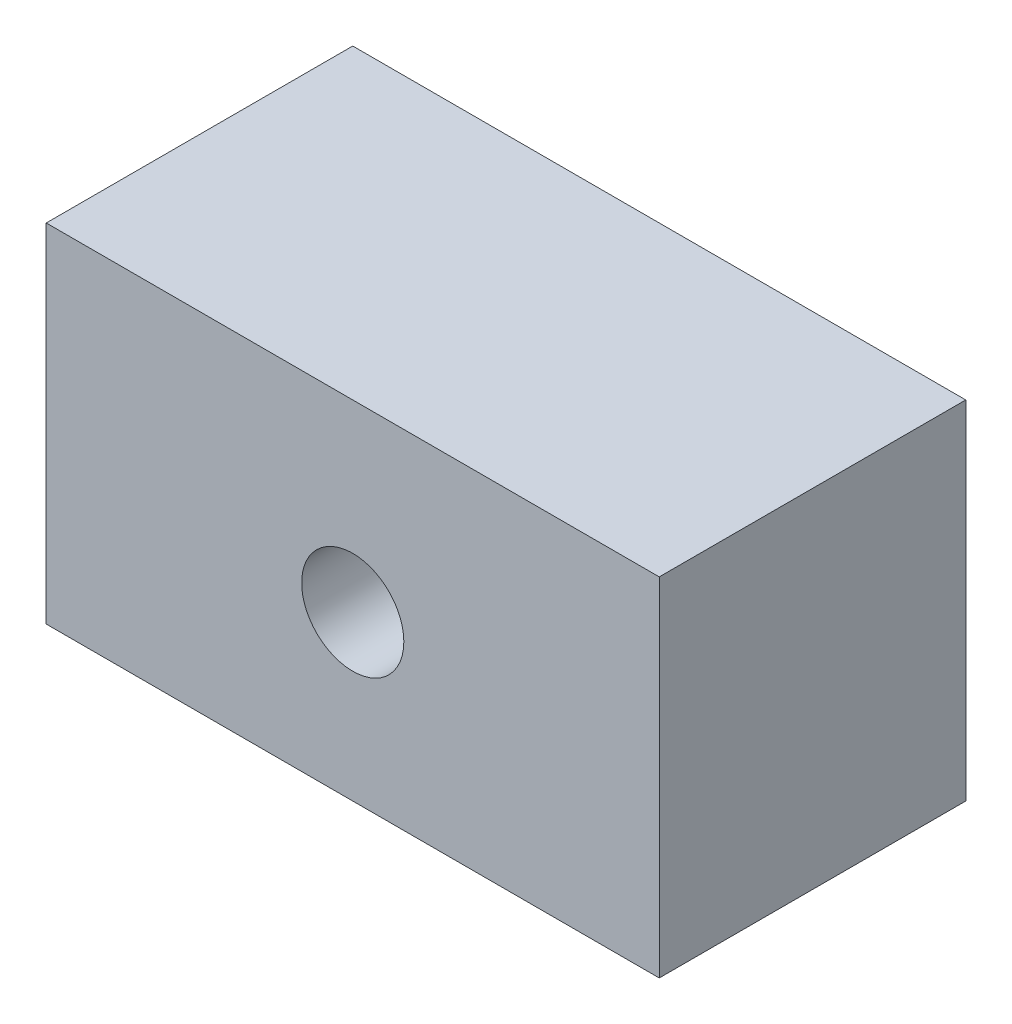
ISO-10303-21;
HEADER;
FILE_DESCRIPTION(('STEP AP214'),'2;1');
FILE_NAME('part.step','',(''),(''),'','','');
FILE_SCHEMA(('AUTOMOTIVE_DESIGN { 1 0 10303 214 1 1 1 1 }'));
ENDSEC;
DATA;
#1=APPLICATION_CONTEXT('core data for automotive mechanical design processes');
#2=APPLICATION_PROTOCOL_DEFINITION('international standard','automotive_design',2000,#1);
#3=PRODUCT_CONTEXT('',#1,'mechanical');
#4=PRODUCT('Part','Part','',(#3));
#5=PRODUCT_RELATED_PRODUCT_CATEGORY('part','',(#4));
#6=PRODUCT_DEFINITION_FORMATION('','',#4);
#7=PRODUCT_DEFINITION_CONTEXT('part definition',#1,'design');
#8=PRODUCT_DEFINITION('design','',#6,#7);
#9=PRODUCT_DEFINITION_SHAPE('','',#8);
#10=(LENGTH_UNIT() NAMED_UNIT(*) SI_UNIT(.MILLI.,.METRE.));
#11=(NAMED_UNIT(*) PLANE_ANGLE_UNIT() SI_UNIT($,.RADIAN.));
#12=(NAMED_UNIT(*) SI_UNIT($,.STERADIAN.) SOLID_ANGLE_UNIT());
#13=UNCERTAINTY_MEASURE_WITH_UNIT(LENGTH_MEASURE(1.E-05),#10,'distance_accuracy_value','');
#14=(GEOMETRIC_REPRESENTATION_CONTEXT(3) GLOBAL_UNCERTAINTY_ASSIGNED_CONTEXT((#13)) GLOBAL_UNIT_ASSIGNED_CONTEXT((#10,
#11,#12)) REPRESENTATION_CONTEXT('',''));
#15=CARTESIAN_POINT('',(0.,0.,0.));
#16=DIRECTION('',(0.,0.,1.));
#17=DIRECTION('',(1.,0.,0.));
#18=AXIS2_PLACEMENT_3D('',#15,#16,#17);
#19=CARTESIAN_POINT('',(0.,0.,0.003500000000031));
#20=DIRECTION('',(0.,0.,1.));
#21=DIRECTION('',(1.,0.,0.));
#22=AXIS2_PLACEMENT_3D('',#19,#20,#21);
#23=PLANE('',#22);
#24=CARTESIAN_POINT('',(30.,16.,0.003500000000031));
#25=DIRECTION('',(0.,0.,1.));
#26=DIRECTION('',(1.,0.,0.));
#27=AXIS2_PLACEMENT_3D('',#24,#25,#26);
#28=CIRCLE('',#27,5.);
#29=CARTESIAN_POINT('',(35.,16.,0.003500000000031));
#30=VERTEX_POINT('',#29);
#31=EDGE_CURVE('E18',#30,#30,#28,.T.);
#32=ORIENTED_EDGE('',*,*,#31,.T.);
#33=EDGE_LOOP('',(#32));
#34=FACE_BOUND('',#33,.T.);
#35=DIRECTION('',(0.,1.,0.));
#36=VECTOR('',#35,1.);
#37=CARTESIAN_POINT('',(60.,0.,0.003500000000031));
#38=LINE('',#37,#36);
#39=CARTESIAN_POINT('',(60.,0.,0.003500000000031));
#40=VERTEX_POINT('',#39);
#41=CARTESIAN_POINT('',(60.,34.,0.003500000000031));
#42=VERTEX_POINT('',#41);
#43=EDGE_CURVE('E59',#40,#42,#38,.T.);
#44=ORIENTED_EDGE('',*,*,#43,.F.);
#45=DIRECTION('',(1.,0.,0.));
#46=VECTOR('',#45,1.);
#47=CARTESIAN_POINT('',(0.,0.,0.003500000000031));
#48=LINE('',#47,#46);
#49=CARTESIAN_POINT('',(0.,0.,0.003500000000031));
#50=VERTEX_POINT('',#49);
#51=EDGE_CURVE('E53',#40,#50,#48,.F.);
#52=ORIENTED_EDGE('',*,*,#51,.T.);
#53=DIRECTION('',(0.,1.,0.));
#54=VECTOR('',#53,1.);
#55=CARTESIAN_POINT('',(0.,0.,0.003500000000031));
#56=LINE('',#55,#54);
#57=CARTESIAN_POINT('',(0.,34.,0.003500000000031));
#58=VERTEX_POINT('',#57);
#59=EDGE_CURVE('E57',#50,#58,#56,.T.);
#60=ORIENTED_EDGE('',*,*,#59,.T.);
#61=DIRECTION('',(1.,0.,0.));
#62=VECTOR('',#61,1.);
#63=CARTESIAN_POINT('',(0.,34.,0.003500000000031));
#64=LINE('',#63,#62);
#65=EDGE_CURVE('E79',#42,#58,#64,.F.);
#66=ORIENTED_EDGE('',*,*,#65,.F.);
#67=EDGE_LOOP('',(#44,#52,#60,#66));
#68=FACE_BOUND('',#67,.T.);
#69=ADVANCED_FACE('F15',(#34,#68),#23,.F.);
#70=CARTESIAN_POINT('',(0.,0.,0.003500000000031));
#71=DIRECTION('',(1.,0.,0.));
#72=DIRECTION('',(0.,0.,-1.));
#73=AXIS2_PLACEMENT_3D('',#70,#71,#72);
#74=PLANE('',#73);
#75=DIRECTION('',(0.,0.,1.));
#76=VECTOR('',#75,1.);
#77=CARTESIAN_POINT('',(0.,34.,0.003500000000031));
#78=LINE('',#77,#76);
#79=CARTESIAN_POINT('',(0.,34.,30.0035));
#80=VERTEX_POINT('',#79);
#81=EDGE_CURVE('E67',#58,#80,#78,.T.);
#82=ORIENTED_EDGE('',*,*,#81,.F.);
#83=ORIENTED_EDGE('',*,*,#59,.F.);
#84=DIRECTION('',(0.,0.,1.));
#85=VECTOR('',#84,1.);
#86=CARTESIAN_POINT('',(0.,0.,0.003500000000031));
#87=LINE('',#86,#85);
#88=CARTESIAN_POINT('',(0.,0.,30.0035));
#89=VERTEX_POINT('',#88);
#90=EDGE_CURVE('E61',#50,#89,#87,.T.);
#91=ORIENTED_EDGE('',*,*,#90,.T.);
#92=DIRECTION('',(0.,1.,0.));
#93=VECTOR('',#92,1.);
#94=CARTESIAN_POINT('',(0.,0.,30.0035));
#95=LINE('',#94,#93);
#96=EDGE_CURVE('E83',#80,#89,#95,.F.);
#97=ORIENTED_EDGE('',*,*,#96,.F.);
#98=EDGE_LOOP('',(#82,#83,#91,#97));
#99=FACE_BOUND('',#98,.T.);
#100=ADVANCED_FACE('F64',(#99),#74,.F.);
#101=CARTESIAN_POINT('',(0.,0.,0.003500000000031));
#102=DIRECTION('',(0.,1.,0.));
#103=DIRECTION('',(0.,0.,1.));
#104=AXIS2_PLACEMENT_3D('',#101,#102,#103);
#105=PLANE('',#104);
#106=DIRECTION('',(1.,0.,0.));
#107=VECTOR('',#106,1.);
#108=CARTESIAN_POINT('',(0.,0.,30.0035));
#109=LINE('',#108,#107);
#110=CARTESIAN_POINT('',(60.,0.,30.0035));
#111=VERTEX_POINT('',#110);
#112=EDGE_CURVE('E72',#89,#111,#109,.T.);
#113=ORIENTED_EDGE('',*,*,#112,.F.);
#114=ORIENTED_EDGE('',*,*,#90,.F.);
#115=ORIENTED_EDGE('',*,*,#51,.F.);
#116=DIRECTION('',(0.,0.,-1.));
#117=VECTOR('',#116,1.);
#118=CARTESIAN_POINT('',(60.,0.,0.003500000000031));
#119=LINE('',#118,#117);
#120=EDGE_CURVE('E74',#111,#40,#119,.T.);
#121=ORIENTED_EDGE('',*,*,#120,.F.);
#122=EDGE_LOOP('',(#113,#114,#115,#121));
#123=FACE_BOUND('',#122,.T.);
#124=ADVANCED_FACE('F70',(#123),#105,.F.);
#125=CARTESIAN_POINT('',(60.,0.,0.003500000000031));
#126=DIRECTION('',(1.,0.,0.));
#127=DIRECTION('',(0.,0.,-1.));
#128=AXIS2_PLACEMENT_3D('',#125,#126,#127);
#129=PLANE('',#128);
#130=DIRECTION('',(0.,0.,1.));
#131=VECTOR('',#130,1.);
#132=CARTESIAN_POINT('',(60.,34.,0.003500000000031));
#133=LINE('',#132,#131);
#134=CARTESIAN_POINT('',(60.,34.,30.0035));
#135=VERTEX_POINT('',#134);
#136=EDGE_CURVE('E32',#135,#42,#133,.F.);
#137=ORIENTED_EDGE('',*,*,#136,.F.);
#138=DIRECTION('',(0.,1.,0.));
#139=VECTOR('',#138,1.);
#140=CARTESIAN_POINT('',(60.,0.,30.0035));
#141=LINE('',#140,#139);
#142=EDGE_CURVE('E86',#111,#135,#141,.T.);
#143=ORIENTED_EDGE('',*,*,#142,.F.);
#144=ORIENTED_EDGE('',*,*,#120,.T.);
#145=ORIENTED_EDGE('',*,*,#43,.T.);
#146=EDGE_LOOP('',(#137,#143,#144,#145));
#147=FACE_BOUND('',#146,.T.);
#148=ADVANCED_FACE('F94',(#147),#129,.T.);
#149=CARTESIAN_POINT('',(0.,34.,0.003500000000031));
#150=DIRECTION('',(0.,1.,0.));
#151=DIRECTION('',(0.,0.,1.));
#152=AXIS2_PLACEMENT_3D('',#149,#150,#151);
#153=PLANE('',#152);
#154=DIRECTION('',(1.,0.,0.));
#155=VECTOR('',#154,1.);
#156=CARTESIAN_POINT('',(0.,34.,30.0035));
#157=LINE('',#156,#155);
#158=EDGE_CURVE('E24',#135,#80,#157,.F.);
#159=ORIENTED_EDGE('',*,*,#158,.F.);
#160=ORIENTED_EDGE('',*,*,#136,.T.);
#161=ORIENTED_EDGE('',*,*,#65,.T.);
#162=ORIENTED_EDGE('',*,*,#81,.T.);
#163=EDGE_LOOP('',(#159,#160,#161,#162));
#164=FACE_BOUND('',#163,.T.);
#165=ADVANCED_FACE('F93',(#164),#153,.T.);
#166=CARTESIAN_POINT('',(30.,16.,0.003500000000031));
#167=DIRECTION('',(0.,0.,1.));
#168=DIRECTION('',(1.,0.,0.));
#169=AXIS2_PLACEMENT_3D('',#166,#167,#168);
#170=CYLINDRICAL_SURFACE('',#169,5.);
#171=ORIENTED_EDGE('',*,*,#31,.F.);
#172=EDGE_LOOP('',(#171));
#173=FACE_BOUND('',#172,.T.);
#174=CARTESIAN_POINT('',(30.,16.,30.0035));
#175=DIRECTION('',(0.,0.,1.));
#176=DIRECTION('',(1.,0.,0.));
#177=AXIS2_PLACEMENT_3D('',#174,#175,#176);
#178=CIRCLE('',#177,5.);
#179=CARTESIAN_POINT('',(35.,16.,30.0035));
#180=VERTEX_POINT('',#179);
#181=EDGE_CURVE('E9',#180,#180,#178,.F.);
#182=ORIENTED_EDGE('',*,*,#181,.F.);
#183=EDGE_LOOP('',(#182));
#184=FACE_BOUND('',#183,.T.);
#185=ADVANCED_FACE('F102',(#173,#184),#170,.F.);
#186=CARTESIAN_POINT('',(0.,0.,30.0035));
#187=DIRECTION('',(0.,0.,1.));
#188=DIRECTION('',(1.,0.,0.));
#189=AXIS2_PLACEMENT_3D('',#186,#187,#188);
#190=PLANE('',#189);
#191=ORIENTED_EDGE('',*,*,#181,.T.);
#192=EDGE_LOOP('',(#191));
#193=FACE_BOUND('',#192,.T.);
#194=ORIENTED_EDGE('',*,*,#142,.T.);
#195=ORIENTED_EDGE('',*,*,#158,.T.);
#196=ORIENTED_EDGE('',*,*,#96,.T.);
#197=ORIENTED_EDGE('',*,*,#112,.T.);
#198=EDGE_LOOP('',(#194,#195,#196,#197));
#199=FACE_BOUND('',#198,.T.);
#200=ADVANCED_FACE('F91',(#193,#199),#190,.T.);
#201=CLOSED_SHELL('',(#69,#100,#124,#148,#165,#185,#200));
#202=MANIFOLD_SOLID_BREP('B1',#201);
#203=ADVANCED_BREP_SHAPE_REPRESENTATION('',(#18,#202),#14);
#204=SHAPE_DEFINITION_REPRESENTATION(#9,#203);
ENDSEC;
END-ISO-10303-21;
